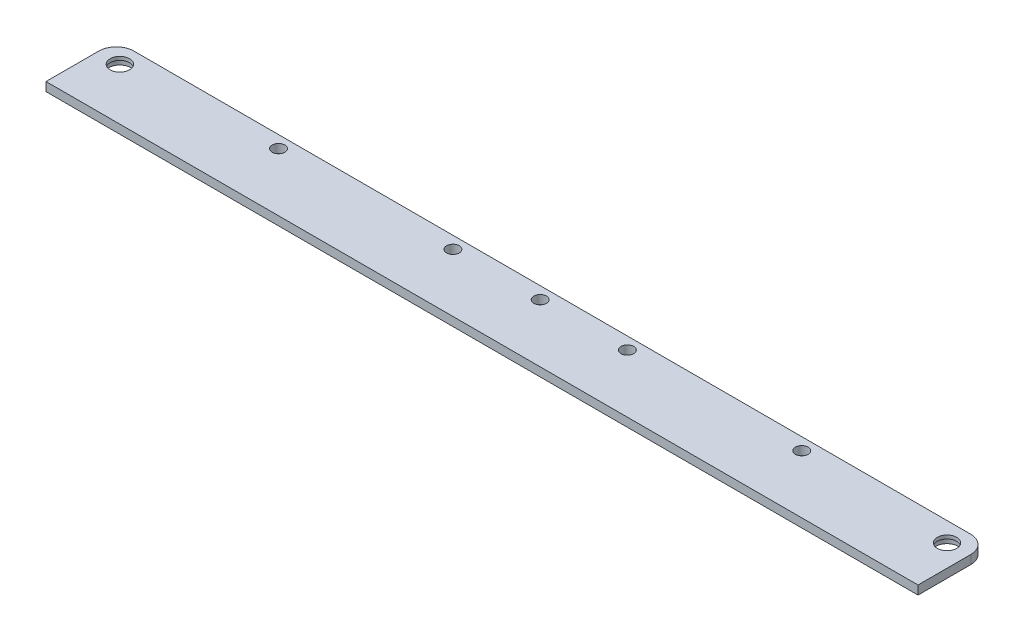
ISO-10303-21;
HEADER;
FILE_DESCRIPTION(('STEP AP214'),'2;1');
FILE_NAME('part.step','',(''),(''),'','','');
FILE_SCHEMA(('AUTOMOTIVE_DESIGN { 1 0 10303 214 1 1 1 1 }'));
ENDSEC;
DATA;
#1=APPLICATION_CONTEXT('core data for automotive mechanical design processes');
#2=APPLICATION_PROTOCOL_DEFINITION('international standard','automotive_design',2000,#1);
#3=PRODUCT_CONTEXT('',#1,'mechanical');
#4=PRODUCT('Part','Part','',(#3));
#5=PRODUCT_RELATED_PRODUCT_CATEGORY('part','',(#4));
#6=PRODUCT_DEFINITION_FORMATION('','',#4);
#7=PRODUCT_DEFINITION_CONTEXT('part definition',#1,'design');
#8=PRODUCT_DEFINITION('design','',#6,#7);
#9=PRODUCT_DEFINITION_SHAPE('','',#8);
#10=(LENGTH_UNIT() NAMED_UNIT(*) SI_UNIT(.MILLI.,.METRE.));
#11=(NAMED_UNIT(*) PLANE_ANGLE_UNIT() SI_UNIT($,.RADIAN.));
#12=(NAMED_UNIT(*) SI_UNIT($,.STERADIAN.) SOLID_ANGLE_UNIT());
#13=UNCERTAINTY_MEASURE_WITH_UNIT(LENGTH_MEASURE(1.E-05),#10,'distance_accuracy_value','');
#14=(GEOMETRIC_REPRESENTATION_CONTEXT(3) GLOBAL_UNCERTAINTY_ASSIGNED_CONTEXT((#13)) GLOBAL_UNIT_ASSIGNED_CONTEXT((#10,
#11,#12)) REPRESENTATION_CONTEXT('',''));
#15=CARTESIAN_POINT('',(0.,0.,0.));
#16=DIRECTION('',(0.,0.,1.));
#17=DIRECTION('',(1.,0.,0.));
#18=AXIS2_PLACEMENT_3D('',#15,#16,#17);
#19=CARTESIAN_POINT('',(-379.799026304364,5.,-53.278006446656));
#20=DIRECTION('',(0.,-1.,0.));
#21=DIRECTION('',(0.,0.,-1.));
#22=AXIS2_PLACEMENT_3D('',#19,#20,#21);
#23=CYLINDRICAL_SURFACE('',#22,5.50000000000002);
#24=CARTESIAN_POINT('',(-379.799026304364,5.,-53.278006446656));
#25=DIRECTION('',(0.,1.,0.));
#26=DIRECTION('',(0.,0.,1.));
#27=AXIS2_PLACEMENT_3D('',#24,#25,#26);
#28=CIRCLE('',#27,5.50000000000002);
#29=CARTESIAN_POINT('',(-379.799026304364,5.,-47.778006446656));
#30=VERTEX_POINT('',#29);
#31=EDGE_CURVE('E163',#30,#30,#28,.T.);
#32=ORIENTED_EDGE('',*,*,#31,.T.);
#33=EDGE_LOOP('',(#32));
#34=FACE_BOUND('',#33,.T.);
#35=CARTESIAN_POINT('',(-379.799026304364,3.,-53.278006446656));
#36=DIRECTION('',(0.,-1.,0.));
#37=DIRECTION('',(0.,0.,-1.));
#38=AXIS2_PLACEMENT_3D('',#35,#36,#37);
#39=CIRCLE('',#38,5.50000000000002);
#40=CARTESIAN_POINT('',(-379.799026304364,3.,-58.778006446656));
#41=VERTEX_POINT('',#40);
#42=EDGE_CURVE('E124',#41,#41,#39,.T.);
#43=ORIENTED_EDGE('',*,*,#42,.T.);
#44=EDGE_LOOP('',(#43));
#45=FACE_BOUND('',#44,.T.);
#46=ADVANCED_FACE('F37',(#34,#45),#23,.F.);
#47=CARTESIAN_POINT('',(91.2009736956353,5.,-52.778006446656));
#48=DIRECTION('',(0.,-1.,0.));
#49=DIRECTION('',(0.,0.,-1.));
#50=AXIS2_PLACEMENT_3D('',#47,#48,#49);
#51=CYLINDRICAL_SURFACE('',#50,5.50000000000002);
#52=CARTESIAN_POINT('',(91.2009736956353,5.,-52.778006446656));
#53=DIRECTION('',(0.,1.,0.));
#54=DIRECTION('',(0.,0.,1.));
#55=AXIS2_PLACEMENT_3D('',#52,#53,#54);
#56=CIRCLE('',#55,5.50000000000002);
#57=CARTESIAN_POINT('',(91.2009736956353,5.,-47.278006446656));
#58=VERTEX_POINT('',#57);
#59=EDGE_CURVE('E168',#58,#58,#56,.T.);
#60=ORIENTED_EDGE('',*,*,#59,.T.);
#61=EDGE_LOOP('',(#60));
#62=FACE_BOUND('',#61,.T.);
#63=CARTESIAN_POINT('',(91.2009736956353,3.,-52.778006446656));
#64=DIRECTION('',(0.,-1.,0.));
#65=DIRECTION('',(0.,0.,-1.));
#66=AXIS2_PLACEMENT_3D('',#63,#64,#65);
#67=CIRCLE('',#66,5.50000000000002);
#68=CARTESIAN_POINT('',(91.2009736956353,3.,-58.278006446656));
#69=VERTEX_POINT('',#68);
#70=EDGE_CURVE('E121',#69,#69,#67,.T.);
#71=ORIENTED_EDGE('',*,*,#70,.T.);
#72=EDGE_LOOP('',(#71));
#73=FACE_BOUND('',#72,.T.);
#74=ADVANCED_FACE('F236',(#62,#73),#51,.F.);
#75=CARTESIAN_POINT('',(0.,5.,0.));
#76=DIRECTION('',(0.,1.,0.));
#77=DIRECTION('',(0.,0.,1.));
#78=AXIS2_PLACEMENT_3D('',#75,#76,#77);
#79=PLANE('',#78);
#80=CARTESIAN_POINT('',(-144.299026304364,5.,-56.8446731133226));
#81=DIRECTION('',(0.,1.,0.));
#82=DIRECTION('',(0.,0.,1.));
#83=AXIS2_PLACEMENT_3D('',#80,#81,#82);
#84=CIRCLE('',#83,3.59999999999999);
#85=CARTESIAN_POINT('',(-144.299026304364,5.,-53.2446731133227));
#86=VERTEX_POINT('',#85);
#87=EDGE_CURVE('E181',#86,#86,#84,.T.);
#88=ORIENTED_EDGE('',*,*,#87,.F.);
#89=EDGE_LOOP('',(#88));
#90=FACE_BOUND('',#89,.T.);
#91=CARTESIAN_POINT('',(-94.6990263043644,5.,-56.8446731133226));
#92=DIRECTION('',(0.,1.,0.));
#93=DIRECTION('',(0.,0.,1.));
#94=AXIS2_PLACEMENT_3D('',#91,#92,#93);
#95=CIRCLE('',#94,3.6);
#96=CARTESIAN_POINT('',(-94.6990263043644,5.,-53.2446731133226));
#97=VERTEX_POINT('',#96);
#98=EDGE_CURVE('E171',#97,#97,#95,.T.);
#99=ORIENTED_EDGE('',*,*,#98,.F.);
#100=EDGE_LOOP('',(#99));
#101=FACE_BOUND('',#100,.T.);
#102=ORIENTED_EDGE('',*,*,#31,.F.);
#103=EDGE_LOOP('',(#102));
#104=FACE_BOUND('',#103,.T.);
#105=DIRECTION('',(0.,0.,-1.));
#106=VECTOR('',#105,1.);
#107=CARTESIAN_POINT('',(103.700973695636,5.,-63.778006446656));
#108=LINE('',#107,#106);
#109=CARTESIAN_POINT('',(103.700973695636,5.,-23.778006446656));
#110=VERTEX_POINT('',#109);
#111=CARTESIAN_POINT('',(103.700973695636,5.,-53.778006446656));
#112=VERTEX_POINT('',#111);
#113=EDGE_CURVE('E107',#110,#112,#108,.T.);
#114=ORIENTED_EDGE('',*,*,#113,.T.);
#115=CARTESIAN_POINT('',(93.7009736956356,5.,-53.778006446656));
#116=DIRECTION('',(0.,1.,0.));
#117=DIRECTION('',(0.,0.,1.));
#118=AXIS2_PLACEMENT_3D('',#115,#116,#117);
#119=CIRCLE('',#118,10.);
#120=CARTESIAN_POINT('',(93.7009736956356,5.,-63.778006446656));
#121=VERTEX_POINT('',#120);
#122=EDGE_CURVE('E45',#112,#121,#119,.T.);
#123=ORIENTED_EDGE('',*,*,#122,.T.);
#124=DIRECTION('',(-1.,0.,0.));
#125=VECTOR('',#124,1.);
#126=CARTESIAN_POINT('',(-392.299026304364,5.,-63.778006446656));
#127=LINE('',#126,#125);
#128=CARTESIAN_POINT('',(-382.299026304364,5.,-63.778006446656));
#129=VERTEX_POINT('',#128);
#130=EDGE_CURVE('E117',#121,#129,#127,.T.);
#131=ORIENTED_EDGE('',*,*,#130,.T.);
#132=CARTESIAN_POINT('',(-382.299026304364,5.,-53.778006446656));
#133=DIRECTION('',(0.,1.,0.));
#134=DIRECTION('',(0.,0.,1.));
#135=AXIS2_PLACEMENT_3D('',#132,#133,#134);
#136=CIRCLE('',#135,10.);
#137=CARTESIAN_POINT('',(-392.299026304364,5.,-53.778006446656));
#138=VERTEX_POINT('',#137);
#139=EDGE_CURVE('E52',#129,#138,#136,.T.);
#140=ORIENTED_EDGE('',*,*,#139,.T.);
#141=DIRECTION('',(0.,0.,1.));
#142=VECTOR('',#141,1.);
#143=CARTESIAN_POINT('',(-392.299026304364,5.,-63.778006446656));
#144=LINE('',#143,#142);
#145=CARTESIAN_POINT('',(-392.299026304364,5.,-23.778006446656));
#146=VERTEX_POINT('',#145);
#147=EDGE_CURVE('E90',#138,#146,#144,.T.);
#148=ORIENTED_EDGE('',*,*,#147,.T.);
#149=DIRECTION('',(1.,0.,0.));
#150=VECTOR('',#149,1.);
#151=CARTESIAN_POINT('',(-392.299026304364,5.,-23.778006446656));
#152=LINE('',#151,#150);
#153=EDGE_CURVE('E94',#146,#110,#152,.T.);
#154=ORIENTED_EDGE('',*,*,#153,.T.);
#155=EDGE_LOOP('',(#114,#123,#131,#140,#148,#154));
#156=FACE_BOUND('',#155,.T.);
#157=CARTESIAN_POINT('',(-193.899026304364,5.,-56.8446731133226));
#158=DIRECTION('',(0.,1.,0.));
#159=DIRECTION('',(0.,0.,1.));
#160=AXIS2_PLACEMENT_3D('',#157,#158,#159);
#161=CIRCLE('',#160,3.59999999999999);
#162=CARTESIAN_POINT('',(-193.899026304364,5.,-53.2446731133227));
#163=VERTEX_POINT('',#162);
#164=EDGE_CURVE('E157',#163,#163,#161,.T.);
#165=ORIENTED_EDGE('',*,*,#164,.F.);
#166=EDGE_LOOP('',(#165));
#167=FACE_BOUND('',#166,.T.);
#168=ORIENTED_EDGE('',*,*,#59,.F.);
#169=EDGE_LOOP('',(#168));
#170=FACE_BOUND('',#169,.T.);
#171=CARTESIAN_POINT('',(4.50097369563562,5.,-56.8446731133226));
#172=DIRECTION('',(0.,1.,0.));
#173=DIRECTION('',(0.,0.,1.));
#174=AXIS2_PLACEMENT_3D('',#171,#172,#173);
#175=CIRCLE('',#174,3.6);
#176=CARTESIAN_POINT('',(4.50097369563562,5.,-53.2446731133226));
#177=VERTEX_POINT('',#176);
#178=EDGE_CURVE('E175',#177,#177,#175,.T.);
#179=ORIENTED_EDGE('',*,*,#178,.F.);
#180=EDGE_LOOP('',(#179));
#181=FACE_BOUND('',#180,.T.);
#182=CARTESIAN_POINT('',(-293.099026304364,5.,-56.8446731133226));
#183=DIRECTION('',(0.,1.,0.));
#184=DIRECTION('',(0.,0.,1.));
#185=AXIS2_PLACEMENT_3D('',#182,#183,#184);
#186=CIRCLE('',#185,3.60000000000001);
#187=CARTESIAN_POINT('',(-293.099026304364,5.,-53.2446731133226));
#188=VERTEX_POINT('',#187);
#189=EDGE_CURVE('E187',#188,#188,#186,.T.);
#190=ORIENTED_EDGE('',*,*,#189,.F.);
#191=EDGE_LOOP('',(#190));
#192=FACE_BOUND('',#191,.T.);
#193=ADVANCED_FACE('F92',(#90,#101,#104,#156,#167,#170,#181,#192),#79,.T.);
#194=CARTESIAN_POINT('',(0.,0.,0.));
#195=DIRECTION('',(0.,1.,0.));
#196=DIRECTION('',(0.,0.,1.));
#197=AXIS2_PLACEMENT_3D('',#194,#195,#196);
#198=PLANE('',#197);
#199=CARTESIAN_POINT('',(-379.799026304364,0.,-53.278006446656));
#200=DIRECTION('',(0.,-1.,0.));
#201=DIRECTION('',(0.,0.,-1.));
#202=AXIS2_PLACEMENT_3D('',#199,#200,#201);
#203=CIRCLE('',#202,6.50000000000001);
#204=CARTESIAN_POINT('',(-379.799026304364,0.,-59.778006446656));
#205=VERTEX_POINT('',#204);
#206=EDGE_CURVE('E200',#205,#205,#203,.T.);
#207=ORIENTED_EDGE('',*,*,#206,.F.);
#208=EDGE_LOOP('',(#207));
#209=FACE_BOUND('',#208,.T.);
#210=CARTESIAN_POINT('',(91.2009736956353,0.,-52.778006446656));
#211=DIRECTION('',(0.,-1.,0.));
#212=DIRECTION('',(0.,0.,-1.));
#213=AXIS2_PLACEMENT_3D('',#210,#211,#212);
#214=CIRCLE('',#213,6.50000000000002);
#215=CARTESIAN_POINT('',(91.2009736956353,0.,-59.278006446656));
#216=VERTEX_POINT('',#215);
#217=EDGE_CURVE('E197',#216,#216,#214,.T.);
#218=ORIENTED_EDGE('',*,*,#217,.F.);
#219=EDGE_LOOP('',(#218));
#220=FACE_BOUND('',#219,.T.);
#221=DIRECTION('',(-1.,0.,0.));
#222=VECTOR('',#221,1.);
#223=CARTESIAN_POINT('',(-392.299026304364,0.,-63.778006446656));
#224=LINE('',#223,#222);
#225=CARTESIAN_POINT('',(93.7009736956356,0.,-63.778006446656));
#226=VERTEX_POINT('',#225);
#227=CARTESIAN_POINT('',(-382.299026304364,0.,-63.778006446656));
#228=VERTEX_POINT('',#227);
#229=EDGE_CURVE('E99',#226,#228,#224,.T.);
#230=ORIENTED_EDGE('',*,*,#229,.F.);
#231=CARTESIAN_POINT('',(93.7009736956356,0.,-53.778006446656));
#232=DIRECTION('',(0.,1.,0.));
#233=DIRECTION('',(0.,0.,1.));
#234=AXIS2_PLACEMENT_3D('',#231,#232,#233);
#235=CIRCLE('',#234,10.);
#236=CARTESIAN_POINT('',(103.700973695636,0.,-53.778006446656));
#237=VERTEX_POINT('',#236);
#238=EDGE_CURVE('E133',#226,#237,#235,.F.);
#239=ORIENTED_EDGE('',*,*,#238,.T.);
#240=DIRECTION('',(0.,0.,-1.));
#241=VECTOR('',#240,1.);
#242=CARTESIAN_POINT('',(103.700973695636,0.,-63.778006446656));
#243=LINE('',#242,#241);
#244=CARTESIAN_POINT('',(103.700973695636,0.,-23.778006446656));
#245=VERTEX_POINT('',#244);
#246=EDGE_CURVE('E151',#245,#237,#243,.T.);
#247=ORIENTED_EDGE('',*,*,#246,.F.);
#248=DIRECTION('',(1.,0.,0.));
#249=VECTOR('',#248,1.);
#250=CARTESIAN_POINT('',(-392.299026304364,0.,-23.778006446656));
#251=LINE('',#250,#249);
#252=CARTESIAN_POINT('',(-392.299026304364,0.,-23.778006446656));
#253=VERTEX_POINT('',#252);
#254=EDGE_CURVE('E153',#253,#245,#251,.T.);
#255=ORIENTED_EDGE('',*,*,#254,.F.);
#256=DIRECTION('',(0.,0.,1.));
#257=VECTOR('',#256,1.);
#258=CARTESIAN_POINT('',(-392.299026304364,0.,-63.778006446656));
#259=LINE('',#258,#257);
#260=CARTESIAN_POINT('',(-392.299026304364,0.,-53.778006446656));
#261=VERTEX_POINT('',#260);
#262=EDGE_CURVE('E111',#261,#253,#259,.T.);
#263=ORIENTED_EDGE('',*,*,#262,.F.);
#264=CARTESIAN_POINT('',(-382.299026304364,0.,-53.778006446656));
#265=DIRECTION('',(0.,1.,0.));
#266=DIRECTION('',(0.,0.,1.));
#267=AXIS2_PLACEMENT_3D('',#264,#265,#266);
#268=CIRCLE('',#267,10.);
#269=EDGE_CURVE('E131',#261,#228,#268,.F.);
#270=ORIENTED_EDGE('',*,*,#269,.T.);
#271=EDGE_LOOP('',(#230,#239,#247,#255,#263,#270));
#272=FACE_BOUND('',#271,.T.);
#273=CARTESIAN_POINT('',(-193.899026304364,0.,-56.8446731133226));
#274=DIRECTION('',(0.,1.,0.));
#275=DIRECTION('',(0.,0.,1.));
#276=AXIS2_PLACEMENT_3D('',#273,#274,#275);
#277=CIRCLE('',#276,3.59999999999999);
#278=CARTESIAN_POINT('',(-193.899026304364,0.,-53.2446731133227));
#279=VERTEX_POINT('',#278);
#280=EDGE_CURVE('E160',#279,#279,#277,.T.);
#281=ORIENTED_EDGE('',*,*,#280,.T.);
#282=EDGE_LOOP('',(#281));
#283=FACE_BOUND('',#282,.T.);
#284=CARTESIAN_POINT('',(-94.6990263043644,0.,-56.8446731133226));
#285=DIRECTION('',(0.,1.,0.));
#286=DIRECTION('',(0.,0.,1.));
#287=AXIS2_PLACEMENT_3D('',#284,#285,#286);
#288=CIRCLE('',#287,3.6);
#289=CARTESIAN_POINT('',(-94.6990263043644,0.,-53.2446731133226));
#290=VERTEX_POINT('',#289);
#291=EDGE_CURVE('E172',#290,#290,#288,.T.);
#292=ORIENTED_EDGE('',*,*,#291,.T.);
#293=EDGE_LOOP('',(#292));
#294=FACE_BOUND('',#293,.T.);
#295=CARTESIAN_POINT('',(4.50097369563562,0.,-56.8446731133226));
#296=DIRECTION('',(0.,1.,0.));
#297=DIRECTION('',(0.,0.,1.));
#298=AXIS2_PLACEMENT_3D('',#295,#296,#297);
#299=CIRCLE('',#298,3.6);
#300=CARTESIAN_POINT('',(4.50097369563562,0.,-53.2446731133226));
#301=VERTEX_POINT('',#300);
#302=EDGE_CURVE('E178',#301,#301,#299,.T.);
#303=ORIENTED_EDGE('',*,*,#302,.T.);
#304=EDGE_LOOP('',(#303));
#305=FACE_BOUND('',#304,.T.);
#306=CARTESIAN_POINT('',(-144.299026304364,0.,-56.8446731133226));
#307=DIRECTION('',(0.,1.,0.));
#308=DIRECTION('',(0.,0.,1.));
#309=AXIS2_PLACEMENT_3D('',#306,#307,#308);
#310=CIRCLE('',#309,3.59999999999999);
#311=CARTESIAN_POINT('',(-144.299026304364,0.,-53.2446731133227));
#312=VERTEX_POINT('',#311);
#313=EDGE_CURVE('E184',#312,#312,#310,.T.);
#314=ORIENTED_EDGE('',*,*,#313,.T.);
#315=EDGE_LOOP('',(#314));
#316=FACE_BOUND('',#315,.T.);
#317=CARTESIAN_POINT('',(-293.099026304364,0.,-56.8446731133226));
#318=DIRECTION('',(0.,1.,0.));
#319=DIRECTION('',(0.,0.,1.));
#320=AXIS2_PLACEMENT_3D('',#317,#318,#319);
#321=CIRCLE('',#320,3.60000000000001);
#322=CARTESIAN_POINT('',(-293.099026304364,0.,-53.2446731133226));
#323=VERTEX_POINT('',#322);
#324=EDGE_CURVE('E127',#323,#323,#321,.T.);
#325=ORIENTED_EDGE('',*,*,#324,.T.);
#326=EDGE_LOOP('',(#325));
#327=FACE_BOUND('',#326,.T.);
#328=ADVANCED_FACE('F149',(#209,#220,#272,#283,#294,#305,#316,#327),#198,.F.);
#329=CARTESIAN_POINT('',(-392.299026304364,5.,-63.778006446656));
#330=DIRECTION('',(1.,0.,0.));
#331=DIRECTION('',(0.,0.,-1.));
#332=AXIS2_PLACEMENT_3D('',#329,#330,#331);
#333=PLANE('',#332);
#334=ORIENTED_EDGE('',*,*,#147,.F.);
#335=DIRECTION('',(0.,-1.,0.));
#336=VECTOR('',#335,1.);
#337=CARTESIAN_POINT('',(-392.299026304364,5.,-53.778006446656));
#338=LINE('',#337,#336);
#339=EDGE_CURVE('E11',#138,#261,#338,.T.);
#340=ORIENTED_EDGE('',*,*,#339,.T.);
#341=ORIENTED_EDGE('',*,*,#262,.T.);
#342=DIRECTION('',(0.,-1.,0.));
#343=VECTOR('',#342,1.);
#344=CARTESIAN_POINT('',(-392.299026304364,5.,-23.778006446656));
#345=LINE('',#344,#343);
#346=EDGE_CURVE('E104',#146,#253,#345,.T.);
#347=ORIENTED_EDGE('',*,*,#346,.F.);
#348=EDGE_LOOP('',(#334,#340,#341,#347));
#349=FACE_BOUND('',#348,.T.);
#350=ADVANCED_FACE('F109',(#349),#333,.F.);
#351=CARTESIAN_POINT('',(-392.299026304364,5.,-23.778006446656));
#352=DIRECTION('',(0.,0.,-1.));
#353=DIRECTION('',(-1.,0.,0.));
#354=AXIS2_PLACEMENT_3D('',#351,#352,#353);
#355=PLANE('',#354);
#356=ORIENTED_EDGE('',*,*,#254,.T.);
#357=DIRECTION('',(0.,-1.,0.));
#358=VECTOR('',#357,1.);
#359=CARTESIAN_POINT('',(103.700973695636,5.,-23.778006446656));
#360=LINE('',#359,#358);
#361=EDGE_CURVE('E106',#110,#245,#360,.T.);
#362=ORIENTED_EDGE('',*,*,#361,.F.);
#363=ORIENTED_EDGE('',*,*,#153,.F.);
#364=ORIENTED_EDGE('',*,*,#346,.T.);
#365=EDGE_LOOP('',(#356,#362,#363,#364));
#366=FACE_BOUND('',#365,.T.);
#367=ADVANCED_FACE('F103',(#366),#355,.F.);
#368=CARTESIAN_POINT('',(103.700973695636,5.,-63.778006446656));
#369=DIRECTION('',(-1.,0.,0.));
#370=DIRECTION('',(0.,0.,1.));
#371=AXIS2_PLACEMENT_3D('',#368,#369,#370);
#372=PLANE('',#371);
#373=ORIENTED_EDGE('',*,*,#246,.T.);
#374=DIRECTION('',(0.,-1.,0.));
#375=VECTOR('',#374,1.);
#376=CARTESIAN_POINT('',(103.700973695636,5.,-53.778006446656));
#377=LINE('',#376,#375);
#378=EDGE_CURVE('E60',#237,#112,#377,.F.);
#379=ORIENTED_EDGE('',*,*,#378,.T.);
#380=ORIENTED_EDGE('',*,*,#113,.F.);
#381=ORIENTED_EDGE('',*,*,#361,.T.);
#382=EDGE_LOOP('',(#373,#379,#380,#381));
#383=FACE_BOUND('',#382,.T.);
#384=ADVANCED_FACE('F152',(#383),#372,.F.);
#385=CARTESIAN_POINT('',(-392.299026304364,5.,-63.778006446656));
#386=DIRECTION('',(0.,0.,1.));
#387=DIRECTION('',(1.,0.,0.));
#388=AXIS2_PLACEMENT_3D('',#385,#386,#387);
#389=PLANE('',#388);
#390=ORIENTED_EDGE('',*,*,#130,.F.);
#391=DIRECTION('',(0.,-1.,0.));
#392=VECTOR('',#391,1.);
#393=CARTESIAN_POINT('',(93.7009736956356,5.,-63.778006446656));
#394=LINE('',#393,#392);
#395=EDGE_CURVE('E115',#121,#226,#394,.T.);
#396=ORIENTED_EDGE('',*,*,#395,.T.);
#397=ORIENTED_EDGE('',*,*,#229,.T.);
#398=DIRECTION('',(0.,-1.,0.));
#399=VECTOR('',#398,1.);
#400=CARTESIAN_POINT('',(-382.299026304364,5.,-63.778006446656));
#401=LINE('',#400,#399);
#402=EDGE_CURVE('E113',#228,#129,#401,.F.);
#403=ORIENTED_EDGE('',*,*,#402,.T.);
#404=EDGE_LOOP('',(#390,#396,#397,#403));
#405=FACE_BOUND('',#404,.T.);
#406=ADVANCED_FACE('F141',(#405),#389,.F.);
#407=CARTESIAN_POINT('',(-193.899026304364,5.,-56.8446731133226));
#408=DIRECTION('',(0.,-1.,0.));
#409=DIRECTION('',(0.,0.,-1.));
#410=AXIS2_PLACEMENT_3D('',#407,#408,#409);
#411=CYLINDRICAL_SURFACE('',#410,3.59999999999999);
#412=ORIENTED_EDGE('',*,*,#164,.T.);
#413=EDGE_LOOP('',(#412));
#414=FACE_BOUND('',#413,.T.);
#415=ORIENTED_EDGE('',*,*,#280,.F.);
#416=EDGE_LOOP('',(#415));
#417=FACE_BOUND('',#416,.T.);
#418=ADVANCED_FACE('F247',(#414,#417),#411,.F.);
#419=CARTESIAN_POINT('',(-94.6990263043644,5.,-56.8446731133226));
#420=DIRECTION('',(0.,-1.,0.));
#421=DIRECTION('',(0.,0.,-1.));
#422=AXIS2_PLACEMENT_3D('',#419,#420,#421);
#423=CYLINDRICAL_SURFACE('',#422,3.6);
#424=ORIENTED_EDGE('',*,*,#98,.T.);
#425=EDGE_LOOP('',(#424));
#426=FACE_BOUND('',#425,.T.);
#427=ORIENTED_EDGE('',*,*,#291,.F.);
#428=EDGE_LOOP('',(#427));
#429=FACE_BOUND('',#428,.T.);
#430=ADVANCED_FACE('F250',(#426,#429),#423,.F.);
#431=CARTESIAN_POINT('',(4.50097369563562,5.,-56.8446731133226));
#432=DIRECTION('',(0.,-1.,0.));
#433=DIRECTION('',(0.,0.,-1.));
#434=AXIS2_PLACEMENT_3D('',#431,#432,#433);
#435=CYLINDRICAL_SURFACE('',#434,3.6);
#436=ORIENTED_EDGE('',*,*,#178,.T.);
#437=EDGE_LOOP('',(#436));
#438=FACE_BOUND('',#437,.T.);
#439=ORIENTED_EDGE('',*,*,#302,.F.);
#440=EDGE_LOOP('',(#439));
#441=FACE_BOUND('',#440,.T.);
#442=ADVANCED_FACE('F314',(#438,#441),#435,.F.);
#443=CARTESIAN_POINT('',(-144.299026304364,5.,-56.8446731133226));
#444=DIRECTION('',(0.,-1.,0.));
#445=DIRECTION('',(0.,0.,-1.));
#446=AXIS2_PLACEMENT_3D('',#443,#444,#445);
#447=CYLINDRICAL_SURFACE('',#446,3.59999999999999);
#448=ORIENTED_EDGE('',*,*,#87,.T.);
#449=EDGE_LOOP('',(#448));
#450=FACE_BOUND('',#449,.T.);
#451=ORIENTED_EDGE('',*,*,#313,.F.);
#452=EDGE_LOOP('',(#451));
#453=FACE_BOUND('',#452,.T.);
#454=ADVANCED_FACE('F231',(#450,#453),#447,.F.);
#455=CARTESIAN_POINT('',(-293.099026304364,5.,-56.8446731133226));
#456=DIRECTION('',(0.,-1.,0.));
#457=DIRECTION('',(0.,0.,-1.));
#458=AXIS2_PLACEMENT_3D('',#455,#456,#457);
#459=CYLINDRICAL_SURFACE('',#458,3.60000000000001);
#460=ORIENTED_EDGE('',*,*,#189,.T.);
#461=EDGE_LOOP('',(#460));
#462=FACE_BOUND('',#461,.T.);
#463=ORIENTED_EDGE('',*,*,#324,.F.);
#464=EDGE_LOOP('',(#463));
#465=FACE_BOUND('',#464,.T.);
#466=ADVANCED_FACE('F222',(#462,#465),#459,.F.);
#467=CARTESIAN_POINT('',(91.2009736956353,3.,-52.778006446656));
#468=DIRECTION('',(0.,-1.,0.));
#469=DIRECTION('',(0.,0.,-1.));
#470=AXIS2_PLACEMENT_3D('',#467,#468,#469);
#471=CYLINDRICAL_SURFACE('',#470,6.50000000000002);
#472=CARTESIAN_POINT('',(91.2009736956353,3.,-52.778006446656));
#473=DIRECTION('',(0.,-1.,0.));
#474=DIRECTION('',(0.,0.,-1.));
#475=AXIS2_PLACEMENT_3D('',#472,#473,#474);
#476=CIRCLE('',#475,6.50000000000002);
#477=CARTESIAN_POINT('',(91.2009736956353,3.,-59.278006446656));
#478=VERTEX_POINT('',#477);
#479=EDGE_CURVE('E194',#478,#478,#476,.T.);
#480=ORIENTED_EDGE('',*,*,#479,.F.);
#481=EDGE_LOOP('',(#480));
#482=FACE_BOUND('',#481,.T.);
#483=ORIENTED_EDGE('',*,*,#217,.T.);
#484=EDGE_LOOP('',(#483));
#485=FACE_BOUND('',#484,.T.);
#486=ADVANCED_FACE('F220',(#482,#485),#471,.F.);
#487=CARTESIAN_POINT('',(91.2009736956353,3.,-52.778006446656));
#488=DIRECTION('',(0.,-1.,0.));
#489=DIRECTION('',(0.,0.,-1.));
#490=AXIS2_PLACEMENT_3D('',#487,#488,#489);
#491=PLANE('',#490);
#492=ORIENTED_EDGE('',*,*,#70,.F.);
#493=EDGE_LOOP('',(#492));
#494=FACE_BOUND('',#493,.T.);
#495=ORIENTED_EDGE('',*,*,#479,.T.);
#496=EDGE_LOOP('',(#495));
#497=FACE_BOUND('',#496,.T.);
#498=ADVANCED_FACE('F211',(#494,#497),#491,.T.);
#499=CARTESIAN_POINT('',(-379.799026304364,3.,-53.278006446656));
#500=DIRECTION('',(0.,-1.,0.));
#501=DIRECTION('',(0.,0.,-1.));
#502=AXIS2_PLACEMENT_3D('',#499,#500,#501);
#503=CYLINDRICAL_SURFACE('',#502,6.50000000000001);
#504=CARTESIAN_POINT('',(-379.799026304364,3.,-53.278006446656));
#505=DIRECTION('',(0.,-1.,0.));
#506=DIRECTION('',(0.,0.,-1.));
#507=AXIS2_PLACEMENT_3D('',#504,#505,#506);
#508=CIRCLE('',#507,6.50000000000001);
#509=CARTESIAN_POINT('',(-379.799026304364,3.,-59.778006446656));
#510=VERTEX_POINT('',#509);
#511=EDGE_CURVE('E125',#510,#510,#508,.T.);
#512=ORIENTED_EDGE('',*,*,#511,.F.);
#513=EDGE_LOOP('',(#512));
#514=FACE_BOUND('',#513,.T.);
#515=ORIENTED_EDGE('',*,*,#206,.T.);
#516=EDGE_LOOP('',(#515));
#517=FACE_BOUND('',#516,.T.);
#518=ADVANCED_FACE('F208',(#514,#517),#503,.F.);
#519=CARTESIAN_POINT('',(-379.799026304364,3.,-53.278006446656));
#520=DIRECTION('',(0.,-1.,0.));
#521=DIRECTION('',(0.,0.,-1.));
#522=AXIS2_PLACEMENT_3D('',#519,#520,#521);
#523=PLANE('',#522);
#524=ORIENTED_EDGE('',*,*,#42,.F.);
#525=EDGE_LOOP('',(#524));
#526=FACE_BOUND('',#525,.T.);
#527=ORIENTED_EDGE('',*,*,#511,.T.);
#528=EDGE_LOOP('',(#527));
#529=FACE_BOUND('',#528,.T.);
#530=ADVANCED_FACE('F206',(#526,#529),#523,.T.);
#531=CARTESIAN_POINT('',(93.7009736956356,5.,-53.778006446656));
#532=DIRECTION('',(0.,-1.,0.));
#533=DIRECTION('',(0.,0.,-1.));
#534=AXIS2_PLACEMENT_3D('',#531,#532,#533);
#535=CYLINDRICAL_SURFACE('',#534,10.);
#536=ORIENTED_EDGE('',*,*,#122,.F.);
#537=ORIENTED_EDGE('',*,*,#378,.F.);
#538=ORIENTED_EDGE('',*,*,#238,.F.);
#539=ORIENTED_EDGE('',*,*,#395,.F.);
#540=EDGE_LOOP('',(#536,#537,#538,#539));
#541=FACE_BOUND('',#540,.T.);
#542=ADVANCED_FACE('F146',(#541),#535,.T.);
#543=CARTESIAN_POINT('',(-382.299026304364,5.,-53.778006446656));
#544=DIRECTION('',(0.,-1.,0.));
#545=DIRECTION('',(0.,0.,-1.));
#546=AXIS2_PLACEMENT_3D('',#543,#544,#545);
#547=CYLINDRICAL_SURFACE('',#546,10.);
#548=ORIENTED_EDGE('',*,*,#139,.F.);
#549=ORIENTED_EDGE('',*,*,#402,.F.);
#550=ORIENTED_EDGE('',*,*,#269,.F.);
#551=ORIENTED_EDGE('',*,*,#339,.F.);
#552=EDGE_LOOP('',(#548,#549,#550,#551));
#553=FACE_BOUND('',#552,.T.);
#554=ADVANCED_FACE('F39',(#553),#547,.T.);
#555=CLOSED_SHELL('',(#46,#74,#193,#328,#350,#367,#384,#406,#418,#430,#442,#454,#466,#486,#498,
#518,#530,#542,#554));
#556=MANIFOLD_SOLID_BREP('B2',#555);
#557=ADVANCED_BREP_SHAPE_REPRESENTATION('',(#18,#556),#14);
#558=SHAPE_DEFINITION_REPRESENTATION(#9,#557);
ENDSEC;
END-ISO-10303-21;
